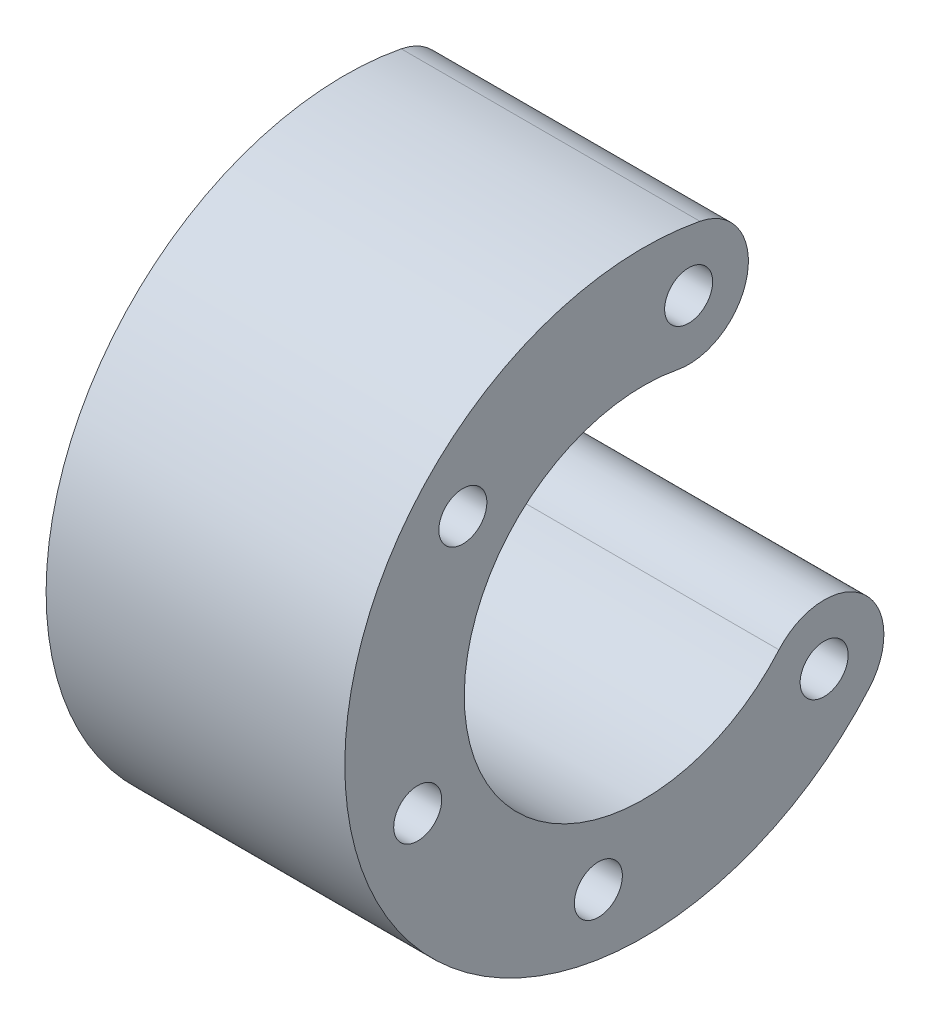
ISO-10303-21;
HEADER;
FILE_DESCRIPTION(('STEP AP214'),'2;1');
FILE_NAME('part.step','',(''),(''),'','','');
FILE_SCHEMA(('AUTOMOTIVE_DESIGN { 1 0 10303 214 1 1 1 1 }'));
ENDSEC;
DATA;
#1=APPLICATION_CONTEXT('core data for automotive mechanical design processes');
#2=APPLICATION_PROTOCOL_DEFINITION('international standard','automotive_design',2000,#1);
#3=PRODUCT_CONTEXT('',#1,'mechanical');
#4=PRODUCT('Part','Part','',(#3));
#5=PRODUCT_RELATED_PRODUCT_CATEGORY('part','',(#4));
#6=PRODUCT_DEFINITION_FORMATION('','',#4);
#7=PRODUCT_DEFINITION_CONTEXT('part definition',#1,'design');
#8=PRODUCT_DEFINITION('design','',#6,#7);
#9=PRODUCT_DEFINITION_SHAPE('','',#8);
#10=(LENGTH_UNIT() NAMED_UNIT(*) SI_UNIT(.MILLI.,.METRE.));
#11=(NAMED_UNIT(*) PLANE_ANGLE_UNIT() SI_UNIT($,.RADIAN.));
#12=(NAMED_UNIT(*) SI_UNIT($,.STERADIAN.) SOLID_ANGLE_UNIT());
#13=UNCERTAINTY_MEASURE_WITH_UNIT(LENGTH_MEASURE(1.E-05),#10,'distance_accuracy_value','');
#14=(GEOMETRIC_REPRESENTATION_CONTEXT(3) GLOBAL_UNCERTAINTY_ASSIGNED_CONTEXT((#13)) GLOBAL_UNIT_ASSIGNED_CONTEXT((#10,
#11,#12)) REPRESENTATION_CONTEXT('',''));
#15=CARTESIAN_POINT('',(0.,0.,0.));
#16=DIRECTION('',(0.,0.,1.));
#17=DIRECTION('',(1.,0.,0.));
#18=AXIS2_PLACEMENT_3D('',#15,#16,#17);
#19=CARTESIAN_POINT('',(284.25,-453.80069009883,142.054321334039));
#20=DIRECTION('',(-1.,0.,0.));
#21=DIRECTION('',(0.,-1.,0.));
#22=AXIS2_PLACEMENT_3D('',#19,#20,#21);
#23=PLANE('',#22);
#24=CARTESIAN_POINT('',(284.25,-608.82733699101,204.255208493666));
#25=DIRECTION('',(-1.,0.,0.));
#26=DIRECTION('',(0.,-1.,0.));
#27=AXIS2_PLACEMENT_3D('',#24,#25,#26);
#28=CIRCLE('',#27,2.5527);
#29=CARTESIAN_POINT('',(284.25,-611.38003699101,204.255208493666));
#30=VERTEX_POINT('',#29);
#31=EDGE_CURVE('E79',#30,#30,#28,.F.);
#32=ORIENTED_EDGE('',*,*,#31,.T.);
#33=EDGE_LOOP('',(#32));
#34=FACE_BOUND('',#33,.T.);
#35=CARTESIAN_POINT('',(284.25,-600.517434286765,247.45735562834));
#36=DIRECTION('',(-1.,0.,0.));
#37=DIRECTION('',(0.,-1.,0.));
#38=AXIS2_PLACEMENT_3D('',#35,#36,#37);
#39=CIRCLE('',#38,2.5527);
#40=CARTESIAN_POINT('',(284.25,-603.070134286765,247.45735562834));
#41=VERTEX_POINT('',#40);
#42=EDGE_CURVE('E92',#41,#41,#39,.F.);
#43=ORIENTED_EDGE('',*,*,#42,.T.);
#44=EDGE_LOOP('',(#43));
#45=FACE_BOUND('',#44,.T.);
#46=CARTESIAN_POINT('',(284.25,-617.143771277774,228.255144342621));
#47=DIRECTION('',(-1.,0.,0.));
#48=DIRECTION('',(0.,-1.,0.));
#49=AXIS2_PLACEMENT_3D('',#46,#47,#48);
#50=CIRCLE('',#49,2.55269999999996);
#51=CARTESIAN_POINT('',(284.25,-619.696471277774,228.255144342621));
#52=VERTEX_POINT('',#51);
#53=EDGE_CURVE('E99',#52,#52,#50,.F.);
#54=ORIENTED_EDGE('',*,*,#53,.T.);
#55=EDGE_LOOP('',(#54));
#56=FACE_BOUND('',#55,.T.);
#57=CARTESIAN_POINT('',(284.25,-592.201,223.457419779386));
#58=DIRECTION('',(-1.,0.,0.));
#59=DIRECTION('',(0.,-1.,0.));
#60=AXIS2_PLACEMENT_3D('',#57,#58,#59);
#61=CIRCLE('',#60,19.05);
#62=CARTESIAN_POINT('',(284.25,-604.670752743257,209.055761315096));
#63=VERTEX_POINT('',#62);
#64=CARTESIAN_POINT('',(284.25,-573.49392154167,219.859126356959));
#65=VERTEX_POINT('',#64);
#66=EDGE_CURVE('E104',#63,#65,#61,.T.);
#67=ORIENTED_EDGE('',*,*,#66,.F.);
#68=CARTESIAN_POINT('',(284.25,-608.82733699101,204.255208493666));
#69=DIRECTION('',(-1.,0.,0.));
#70=DIRECTION('',(0.,-1.,0.));
#71=AXIS2_PLACEMENT_3D('',#68,#69,#70);
#72=CIRCLE('',#71,6.35000000000012);
#73=CARTESIAN_POINT('',(284.25,-612.983921238762,199.454655672236));
#74=VERTEX_POINT('',#73);
#75=EDGE_CURVE('E74',#63,#74,#72,.T.);
#76=ORIENTED_EDGE('',*,*,#75,.T.);
#77=CARTESIAN_POINT('',(284.25,-592.201,223.457419779386));
#78=DIRECTION('',(-1.,0.,0.));
#79=DIRECTION('',(0.,-1.,0.));
#80=AXIS2_PLACEMENT_3D('',#77,#78,#79);
#81=CIRCLE('',#80,31.75);
#82=CARTESIAN_POINT('',(284.25,-561.022535902783,217.460264075341));
#83=VERTEX_POINT('',#82);
#84=EDGE_CURVE('E61',#74,#83,#81,.T.);
#85=ORIENTED_EDGE('',*,*,#84,.T.);
#86=CARTESIAN_POINT('',(284.25,-567.258228722227,218.65969521615));
#87=DIRECTION('',(-1.,0.,0.));
#88=DIRECTION('',(0.,-1.,0.));
#89=AXIS2_PLACEMENT_3D('',#86,#87,#88);
#90=CIRCLE('',#89,6.35000000000018);
#91=EDGE_CURVE('E71',#83,#65,#90,.T.);
#92=ORIENTED_EDGE('',*,*,#91,.T.);
#93=EDGE_LOOP('',(#67,#76,#85,#92));
#94=FACE_BOUND('',#93,.T.);
#95=CARTESIAN_POINT('',(284.25,-575.574663008991,242.659631065104));
#96=DIRECTION('',(-1.,0.,0.));
#97=DIRECTION('',(0.,-1.,0.));
#98=AXIS2_PLACEMENT_3D('',#95,#96,#97);
#99=CIRCLE('',#98,2.5527);
#100=CARTESIAN_POINT('',(284.25,-578.127363008991,242.659631065104));
#101=VERTEX_POINT('',#100);
#102=EDGE_CURVE('E95',#101,#101,#99,.F.);
#103=ORIENTED_EDGE('',*,*,#102,.T.);
#104=EDGE_LOOP('',(#103));
#105=FACE_BOUND('',#104,.T.);
#106=CARTESIAN_POINT('',(284.25,-567.258228722227,218.65969521615));
#107=DIRECTION('',(-1.,0.,0.));
#108=DIRECTION('',(0.,-1.,0.));
#109=AXIS2_PLACEMENT_3D('',#106,#107,#108);
#110=CIRCLE('',#109,2.55269999999996);
#111=CARTESIAN_POINT('',(284.25,-569.810928722227,218.65969521615));
#112=VERTEX_POINT('',#111);
#113=EDGE_CURVE('E85',#112,#112,#110,.F.);
#114=ORIENTED_EDGE('',*,*,#113,.T.);
#115=EDGE_LOOP('',(#114));
#116=FACE_BOUND('',#115,.T.);
#117=ADVANCED_FACE('F17',(#34,#45,#56,#94,#105,#116),#23,.T.);
#118=CARTESIAN_POINT('',(284.248,-592.201,223.457419779386));
#119=DIRECTION('',(1.,0.,0.));
#120=DIRECTION('',(0.,1.,0.));
#121=AXIS2_PLACEMENT_3D('',#118,#119,#120);
#122=CYLINDRICAL_SURFACE('',#121,31.75);
#123=ORIENTED_EDGE('',*,*,#84,.F.);
#124=DIRECTION('',(1.,0.,0.));
#125=VECTOR('',#124,1.);
#126=CARTESIAN_POINT('',(284.248,-612.983921238762,199.454655672236));
#127=LINE('',#126,#125);
#128=CARTESIAN_POINT('',(316.,-612.983921238762,199.454655672236));
#129=VERTEX_POINT('',#128);
#130=EDGE_CURVE('E35',#74,#129,#127,.T.);
#131=ORIENTED_EDGE('',*,*,#130,.T.);
#132=CARTESIAN_POINT('',(316.,-592.201,223.457419779386));
#133=DIRECTION('',(-1.,0.,0.));
#134=DIRECTION('',(0.,-1.,0.));
#135=AXIS2_PLACEMENT_3D('',#132,#133,#134);
#136=CIRCLE('',#135,31.75);
#137=CARTESIAN_POINT('',(316.,-561.022535902783,217.460264075341));
#138=VERTEX_POINT('',#137);
#139=EDGE_CURVE('E62',#129,#138,#136,.T.);
#140=ORIENTED_EDGE('',*,*,#139,.T.);
#141=DIRECTION('',(1.,0.,0.));
#142=VECTOR('',#141,1.);
#143=CARTESIAN_POINT('',(284.248,-561.022535902783,217.460264075341));
#144=LINE('',#143,#142);
#145=EDGE_CURVE('E43',#83,#138,#144,.T.);
#146=ORIENTED_EDGE('',*,*,#145,.F.);
#147=EDGE_LOOP('',(#123,#131,#140,#146));
#148=FACE_BOUND('',#147,.T.);
#149=ADVANCED_FACE('F60',(#148),#122,.T.);
#150=CARTESIAN_POINT('',(316.,-453.80069009883,202.216209889692));
#151=DIRECTION('',(-1.,0.,0.));
#152=DIRECTION('',(0.,-1.,0.));
#153=AXIS2_PLACEMENT_3D('',#150,#151,#152);
#154=PLANE('',#153);
#155=CARTESIAN_POINT('',(316.,-617.143771277774,228.255144342621));
#156=DIRECTION('',(1.,0.,0.));
#157=DIRECTION('',(0.,1.,0.));
#158=AXIS2_PLACEMENT_3D('',#155,#156,#157);
#159=CIRCLE('',#158,2.55269999999996);
#160=CARTESIAN_POINT('',(316.,-614.591071277774,228.255144342621));
#161=VERTEX_POINT('',#160);
#162=EDGE_CURVE('E11',#161,#161,#159,.T.);
#163=ORIENTED_EDGE('',*,*,#162,.F.);
#164=EDGE_LOOP('',(#163));
#165=FACE_BOUND('',#164,.T.);
#166=CARTESIAN_POINT('',(316.,-575.574663008991,242.659631065104));
#167=DIRECTION('',(1.,0.,0.));
#168=DIRECTION('',(0.,1.,0.));
#169=AXIS2_PLACEMENT_3D('',#166,#167,#168);
#170=CIRCLE('',#169,2.5527);
#171=CARTESIAN_POINT('',(316.,-573.021963008991,242.659631065104));
#172=VERTEX_POINT('',#171);
#173=EDGE_CURVE('E27',#172,#172,#170,.T.);
#174=ORIENTED_EDGE('',*,*,#173,.F.);
#175=EDGE_LOOP('',(#174));
#176=FACE_BOUND('',#175,.T.);
#177=CARTESIAN_POINT('',(316.,-600.517434286765,247.45735562834));
#178=DIRECTION('',(1.,0.,0.));
#179=DIRECTION('',(0.,1.,0.));
#180=AXIS2_PLACEMENT_3D('',#177,#178,#179);
#181=CIRCLE('',#180,2.5527);
#182=CARTESIAN_POINT('',(316.,-597.964734286765,247.45735562834));
#183=VERTEX_POINT('',#182);
#184=EDGE_CURVE('E136',#183,#183,#181,.T.);
#185=ORIENTED_EDGE('',*,*,#184,.F.);
#186=EDGE_LOOP('',(#185));
#187=FACE_BOUND('',#186,.T.);
#188=CARTESIAN_POINT('',(316.,-567.258228722227,218.65969521615));
#189=DIRECTION('',(1.,0.,0.));
#190=DIRECTION('',(0.,1.,0.));
#191=AXIS2_PLACEMENT_3D('',#188,#189,#190);
#192=CIRCLE('',#191,2.55269999999996);
#193=CARTESIAN_POINT('',(316.,-564.705528722227,218.65969521615));
#194=VERTEX_POINT('',#193);
#195=EDGE_CURVE('E132',#194,#194,#192,.T.);
#196=ORIENTED_EDGE('',*,*,#195,.F.);
#197=EDGE_LOOP('',(#196));
#198=FACE_BOUND('',#197,.T.);
#199=CARTESIAN_POINT('',(316.,-608.82733699101,204.255208493666));
#200=DIRECTION('',(1.,0.,0.));
#201=DIRECTION('',(0.,1.,0.));
#202=AXIS2_PLACEMENT_3D('',#199,#200,#201);
#203=CIRCLE('',#202,2.5527);
#204=CARTESIAN_POINT('',(316.,-606.27463699101,204.255208493666));
#205=VERTEX_POINT('',#204);
#206=EDGE_CURVE('E129',#205,#205,#203,.T.);
#207=ORIENTED_EDGE('',*,*,#206,.F.);
#208=EDGE_LOOP('',(#207));
#209=FACE_BOUND('',#208,.T.);
#210=CARTESIAN_POINT('',(316.,-608.82733699101,204.255208493666));
#211=DIRECTION('',(-1.,0.,0.));
#212=DIRECTION('',(0.,-1.,0.));
#213=AXIS2_PLACEMENT_3D('',#210,#211,#212);
#214=CIRCLE('',#213,6.35000000000012);
#215=CARTESIAN_POINT('',(316.,-604.670752743257,209.055761315096));
#216=VERTEX_POINT('',#215);
#217=EDGE_CURVE('E126',#216,#129,#214,.T.);
#218=ORIENTED_EDGE('',*,*,#217,.F.);
#219=CARTESIAN_POINT('',(316.,-592.201,223.457419779386));
#220=DIRECTION('',(-1.,0.,0.));
#221=DIRECTION('',(0.,-1.,0.));
#222=AXIS2_PLACEMENT_3D('',#219,#220,#221);
#223=CIRCLE('',#222,19.05);
#224=CARTESIAN_POINT('',(316.,-573.49392154167,219.859126356959));
#225=VERTEX_POINT('',#224);
#226=EDGE_CURVE('E110',#216,#225,#223,.T.);
#227=ORIENTED_EDGE('',*,*,#226,.T.);
#228=CARTESIAN_POINT('',(316.,-567.258228722227,218.65969521615));
#229=DIRECTION('',(-1.,0.,0.));
#230=DIRECTION('',(0.,-1.,0.));
#231=AXIS2_PLACEMENT_3D('',#228,#229,#230);
#232=CIRCLE('',#231,6.35000000000018);
#233=EDGE_CURVE('E117',#138,#225,#232,.T.);
#234=ORIENTED_EDGE('',*,*,#233,.F.);
#235=ORIENTED_EDGE('',*,*,#139,.F.);
#236=EDGE_LOOP('',(#218,#227,#234,#235));
#237=FACE_BOUND('',#236,.T.);
#238=ADVANCED_FACE('F147',(#165,#176,#187,#198,#209,#237),#154,.F.);
#239=CARTESIAN_POINT('',(284.248,-567.258228722227,218.65969521615));
#240=DIRECTION('',(1.,0.,0.));
#241=DIRECTION('',(0.,1.,0.));
#242=AXIS2_PLACEMENT_3D('',#239,#240,#241);
#243=CYLINDRICAL_SURFACE('',#242,6.35000000000018);
#244=ORIENTED_EDGE('',*,*,#91,.F.);
#245=ORIENTED_EDGE('',*,*,#145,.T.);
#246=ORIENTED_EDGE('',*,*,#233,.T.);
#247=DIRECTION('',(1.,0.,0.));
#248=VECTOR('',#247,1.);
#249=CARTESIAN_POINT('',(284.248,-573.49392154167,219.859126356959));
#250=LINE('',#249,#248);
#251=EDGE_CURVE('E65',#65,#225,#250,.T.);
#252=ORIENTED_EDGE('',*,*,#251,.F.);
#253=EDGE_LOOP('',(#244,#245,#246,#252));
#254=FACE_BOUND('',#253,.T.);
#255=ADVANCED_FACE('F77',(#254),#243,.T.);
#256=CARTESIAN_POINT('',(284.248,-608.82733699101,204.255208493666));
#257=DIRECTION('',(1.,0.,0.));
#258=DIRECTION('',(0.,1.,0.));
#259=AXIS2_PLACEMENT_3D('',#256,#257,#258);
#260=CYLINDRICAL_SURFACE('',#259,6.35000000000012);
#261=ORIENTED_EDGE('',*,*,#75,.F.);
#262=DIRECTION('',(1.,0.,0.));
#263=VECTOR('',#262,1.);
#264=CARTESIAN_POINT('',(284.248,-604.670752743257,209.055761315096));
#265=LINE('',#264,#263);
#266=EDGE_CURVE('E21',#63,#216,#265,.T.);
#267=ORIENTED_EDGE('',*,*,#266,.T.);
#268=ORIENTED_EDGE('',*,*,#217,.T.);
#269=ORIENTED_EDGE('',*,*,#130,.F.);
#270=EDGE_LOOP('',(#261,#267,#268,#269));
#271=FACE_BOUND('',#270,.T.);
#272=ADVANCED_FACE('F146',(#271),#260,.T.);
#273=CARTESIAN_POINT('',(284.248,-592.201,223.457419779386));
#274=DIRECTION('',(1.,0.,0.));
#275=DIRECTION('',(0.,1.,0.));
#276=AXIS2_PLACEMENT_3D('',#273,#274,#275);
#277=CYLINDRICAL_SURFACE('',#276,19.05);
#278=ORIENTED_EDGE('',*,*,#266,.F.);
#279=ORIENTED_EDGE('',*,*,#66,.T.);
#280=ORIENTED_EDGE('',*,*,#251,.T.);
#281=ORIENTED_EDGE('',*,*,#226,.F.);
#282=EDGE_LOOP('',(#278,#279,#280,#281));
#283=FACE_BOUND('',#282,.T.);
#284=ADVANCED_FACE('F19',(#283),#277,.F.);
#285=CARTESIAN_POINT('',(284.248,-617.143771277774,228.255144342621));
#286=DIRECTION('',(1.,0.,0.));
#287=DIRECTION('',(0.,1.,0.));
#288=AXIS2_PLACEMENT_3D('',#285,#286,#287);
#289=CYLINDRICAL_SURFACE('',#288,2.55269999999996);
#290=ORIENTED_EDGE('',*,*,#162,.T.);
#291=EDGE_LOOP('',(#290));
#292=FACE_BOUND('',#291,.T.);
#293=ORIENTED_EDGE('',*,*,#53,.F.);
#294=EDGE_LOOP('',(#293));
#295=FACE_BOUND('',#294,.T.);
#296=ADVANCED_FACE('F179',(#292,#295),#289,.F.);
#297=CARTESIAN_POINT('',(284.248,-575.574663008991,242.659631065104));
#298=DIRECTION('',(1.,0.,0.));
#299=DIRECTION('',(0.,1.,0.));
#300=AXIS2_PLACEMENT_3D('',#297,#298,#299);
#301=CYLINDRICAL_SURFACE('',#300,2.5527);
#302=ORIENTED_EDGE('',*,*,#173,.T.);
#303=EDGE_LOOP('',(#302));
#304=FACE_BOUND('',#303,.T.);
#305=ORIENTED_EDGE('',*,*,#102,.F.);
#306=EDGE_LOOP('',(#305));
#307=FACE_BOUND('',#306,.T.);
#308=ADVANCED_FACE('F176',(#304,#307),#301,.F.);
#309=CARTESIAN_POINT('',(284.248,-600.517434286765,247.45735562834));
#310=DIRECTION('',(1.,0.,0.));
#311=DIRECTION('',(0.,1.,0.));
#312=AXIS2_PLACEMENT_3D('',#309,#310,#311);
#313=CYLINDRICAL_SURFACE('',#312,2.5527);
#314=ORIENTED_EDGE('',*,*,#184,.T.);
#315=EDGE_LOOP('',(#314));
#316=FACE_BOUND('',#315,.T.);
#317=ORIENTED_EDGE('',*,*,#42,.F.);
#318=EDGE_LOOP('',(#317));
#319=FACE_BOUND('',#318,.T.);
#320=ADVANCED_FACE('F172',(#316,#319),#313,.F.);
#321=CARTESIAN_POINT('',(284.248,-567.258228722227,218.65969521615));
#322=DIRECTION('',(1.,0.,0.));
#323=DIRECTION('',(0.,1.,0.));
#324=AXIS2_PLACEMENT_3D('',#321,#322,#323);
#325=CYLINDRICAL_SURFACE('',#324,2.55269999999996);
#326=ORIENTED_EDGE('',*,*,#195,.T.);
#327=EDGE_LOOP('',(#326));
#328=FACE_BOUND('',#327,.T.);
#329=ORIENTED_EDGE('',*,*,#113,.F.);
#330=EDGE_LOOP('',(#329));
#331=FACE_BOUND('',#330,.T.);
#332=ADVANCED_FACE('F168',(#328,#331),#325,.F.);
#333=CARTESIAN_POINT('',(284.248,-608.82733699101,204.255208493666));
#334=DIRECTION('',(1.,0.,0.));
#335=DIRECTION('',(0.,1.,0.));
#336=AXIS2_PLACEMENT_3D('',#333,#334,#335);
#337=CYLINDRICAL_SURFACE('',#336,2.5527);
#338=ORIENTED_EDGE('',*,*,#206,.T.);
#339=EDGE_LOOP('',(#338));
#340=FACE_BOUND('',#339,.T.);
#341=ORIENTED_EDGE('',*,*,#31,.F.);
#342=EDGE_LOOP('',(#341));
#343=FACE_BOUND('',#342,.T.);
#344=ADVANCED_FACE('F163',(#340,#343),#337,.F.);
#345=CLOSED_SHELL('',(#117,#149,#238,#255,#272,#284,#296,#308,#320,#332,#344));
#346=MANIFOLD_SOLID_BREP('B1',#345);
#347=ADVANCED_BREP_SHAPE_REPRESENTATION('',(#18,#346),#14);
#348=SHAPE_DEFINITION_REPRESENTATION(#9,#347);
ENDSEC;
END-ISO-10303-21;
